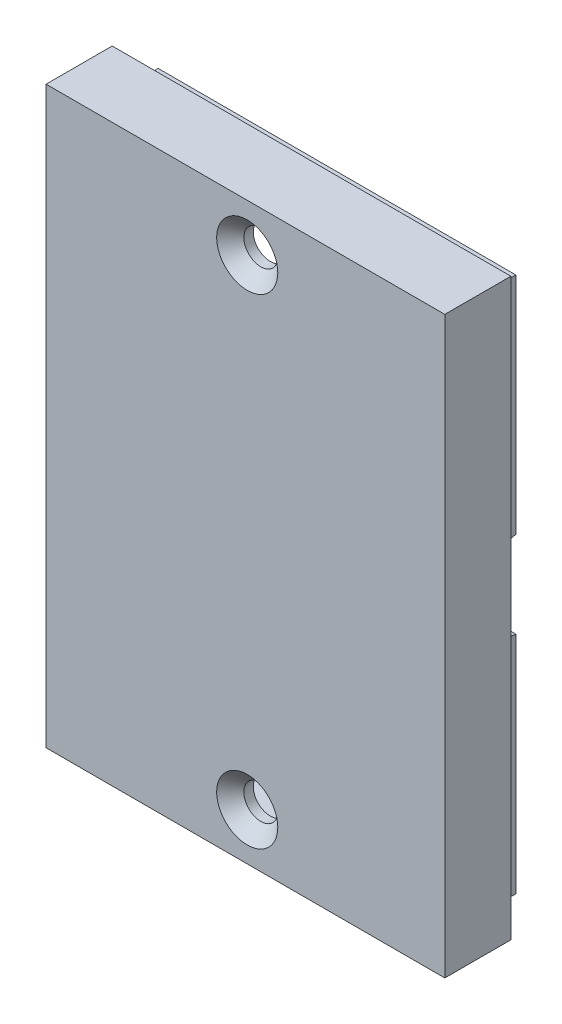
ISO-10303-21;
HEADER;
FILE_DESCRIPTION(('STEP AP214'),'2;1');
FILE_NAME('part.step','',(''),(''),'','','');
FILE_SCHEMA(('AUTOMOTIVE_DESIGN { 1 0 10303 214 1 1 1 1 }'));
ENDSEC;
DATA;
#1=APPLICATION_CONTEXT('core data for automotive mechanical design processes');
#2=APPLICATION_PROTOCOL_DEFINITION('international standard','automotive_design',2000,#1);
#3=PRODUCT_CONTEXT('',#1,'mechanical');
#4=PRODUCT('Part','Part','',(#3));
#5=PRODUCT_RELATED_PRODUCT_CATEGORY('part','',(#4));
#6=PRODUCT_DEFINITION_FORMATION('','',#4);
#7=PRODUCT_DEFINITION_CONTEXT('part definition',#1,'design');
#8=PRODUCT_DEFINITION('design','',#6,#7);
#9=PRODUCT_DEFINITION_SHAPE('','',#8);
#10=(LENGTH_UNIT() NAMED_UNIT(*) SI_UNIT(.MILLI.,.METRE.));
#11=(NAMED_UNIT(*) PLANE_ANGLE_UNIT() SI_UNIT($,.RADIAN.));
#12=(NAMED_UNIT(*) SI_UNIT($,.STERADIAN.) SOLID_ANGLE_UNIT());
#13=UNCERTAINTY_MEASURE_WITH_UNIT(LENGTH_MEASURE(1.E-05),#10,'distance_accuracy_value','');
#14=(GEOMETRIC_REPRESENTATION_CONTEXT(3) GLOBAL_UNCERTAINTY_ASSIGNED_CONTEXT((#13)) GLOBAL_UNIT_ASSIGNED_CONTEXT((#10,
#11,#12)) REPRESENTATION_CONTEXT('',''));
#15=CARTESIAN_POINT('',(0.,0.,0.));
#16=DIRECTION('',(0.,0.,1.));
#17=DIRECTION('',(1.,0.,0.));
#18=AXIS2_PLACEMENT_3D('',#15,#16,#17);
#19=CARTESIAN_POINT('',(0.,0.,0.));
#20=DIRECTION('',(0.,0.,1.));
#21=DIRECTION('',(1.,0.,0.));
#22=AXIS2_PLACEMENT_3D('',#19,#20,#21);
#23=PLANE('',#22);
#24=DIRECTION('',(-1.,0.,0.));
#25=VECTOR('',#24,1.);
#26=CARTESIAN_POINT('',(0.635,46.99,0.));
#27=LINE('',#26,#25);
#28=CARTESIAN_POINT('',(31.115,46.99,0.));
#29=VERTEX_POINT('',#28);
#30=CARTESIAN_POINT('',(0.127,46.99,0.));
#31=VERTEX_POINT('',#30);
#32=EDGE_CURVE('E230',#29,#31,#27,.T.);
#33=ORIENTED_EDGE('',*,*,#32,.T.);
#34=DIRECTION('',(0.,-1.,0.));
#35=VECTOR('',#34,1.);
#36=CARTESIAN_POINT('',(0.127,47.498,0.));
#37=LINE('',#36,#35);
#38=CARTESIAN_POINT('',(0.127,47.498,0.));
#39=VERTEX_POINT('',#38);
#40=EDGE_CURVE('E240',#39,#31,#37,.T.);
#41=ORIENTED_EDGE('',*,*,#40,.F.);
#42=DIRECTION('',(-1.,0.,0.));
#43=VECTOR('',#42,1.);
#44=CARTESIAN_POINT('',(0.127,47.498,0.));
#45=LINE('',#44,#43);
#46=CARTESIAN_POINT('',(31.75,47.498,0.));
#47=VERTEX_POINT('',#46);
#48=EDGE_CURVE('E280',#47,#39,#45,.T.);
#49=ORIENTED_EDGE('',*,*,#48,.F.);
#50=DIRECTION('',(0.,1.,0.));
#51=VECTOR('',#50,1.);
#52=CARTESIAN_POINT('',(31.75,47.498,0.));
#53=LINE('',#52,#51);
#54=CARTESIAN_POINT('',(31.75,27.6225,0.));
#55=VERTEX_POINT('',#54);
#56=EDGE_CURVE('E256',#55,#47,#53,.T.);
#57=ORIENTED_EDGE('',*,*,#56,.F.);
#58=DIRECTION('',(1.,0.,0.));
#59=VECTOR('',#58,1.);
#60=CARTESIAN_POINT('',(-1.906,27.6225,0.));
#61=LINE('',#60,#59);
#62=CARTESIAN_POINT('',(31.115,27.6225,0.));
#63=VERTEX_POINT('',#62);
#64=EDGE_CURVE('E389',#63,#55,#61,.T.);
#65=ORIENTED_EDGE('',*,*,#64,.F.);
#66=DIRECTION('',(0.,1.,0.));
#67=VECTOR('',#66,1.);
#68=CARTESIAN_POINT('',(31.115,46.99,0.));
#69=LINE('',#68,#67);
#70=EDGE_CURVE('E243',#63,#29,#69,.T.);
#71=ORIENTED_EDGE('',*,*,#70,.T.);
#72=EDGE_LOOP('',(#33,#41,#49,#57,#65,#71));
#73=FACE_BOUND('',#72,.T.);
#74=ADVANCED_FACE('F33',(#73),#23,.F.);
#75=CARTESIAN_POINT('',(0.127,44.45,0.));
#76=VERTEX_POINT('',#75);
#77=CARTESIAN_POINT('',(0.127000000000003,25.0825,0.));
#78=VERTEX_POINT('',#77);
#79=EDGE_CURVE('E253',#76,#78,#37,.T.);
#80=ORIENTED_EDGE('',*,*,#79,.F.);
#81=DIRECTION('',(-1.,0.,0.));
#82=VECTOR('',#81,1.);
#83=CARTESIAN_POINT('',(33.3385,44.45,0.));
#84=LINE('',#83,#82);
#85=CARTESIAN_POINT('',(0.635,44.45,0.));
#86=VERTEX_POINT('',#85);
#87=EDGE_CURVE('E359',#86,#76,#84,.T.);
#88=ORIENTED_EDGE('',*,*,#87,.F.);
#89=DIRECTION('',(0.,-1.,0.));
#90=VECTOR('',#89,1.);
#91=CARTESIAN_POINT('',(0.635,46.99,0.));
#92=LINE('',#91,#90);
#93=CARTESIAN_POINT('',(0.635000000000003,25.0825,0.));
#94=VERTEX_POINT('',#93);
#95=EDGE_CURVE('E459',#86,#94,#92,.T.);
#96=ORIENTED_EDGE('',*,*,#95,.T.);
#97=DIRECTION('',(-1.,0.,0.));
#98=VECTOR('',#97,1.);
#99=CARTESIAN_POINT('',(33.3385,25.0825,0.));
#100=LINE('',#99,#98);
#101=EDGE_CURVE('E369',#94,#78,#100,.T.);
#102=ORIENTED_EDGE('',*,*,#101,.T.);
#103=EDGE_LOOP('',(#80,#88,#96,#102));
#104=FACE_BOUND('',#103,.T.);
#105=ADVANCED_FACE('F485',(#104),#23,.F.);
#106=CARTESIAN_POINT('',(0.127000000000003,22.5425,0.));
#107=VERTEX_POINT('',#106);
#108=CARTESIAN_POINT('',(0.127000000000005,3.175,0.));
#109=VERTEX_POINT('',#108);
#110=EDGE_CURVE('E259',#107,#109,#37,.T.);
#111=ORIENTED_EDGE('',*,*,#110,.F.);
#112=DIRECTION('',(-1.,0.,0.));
#113=VECTOR('',#112,1.);
#114=CARTESIAN_POINT('',(33.3385,22.5425,0.));
#115=LINE('',#114,#113);
#116=CARTESIAN_POINT('',(0.635000000000003,22.5425,0.));
#117=VERTEX_POINT('',#116);
#118=EDGE_CURVE('E370',#117,#107,#115,.T.);
#119=ORIENTED_EDGE('',*,*,#118,.F.);
#120=CARTESIAN_POINT('',(0.635000000000005,3.175,0.));
#121=VERTEX_POINT('',#120);
#122=EDGE_CURVE('E456',#117,#121,#92,.T.);
#123=ORIENTED_EDGE('',*,*,#122,.T.);
#124=DIRECTION('',(-1.,0.,0.));
#125=VECTOR('',#124,1.);
#126=CARTESIAN_POINT('',(33.3385,3.175,0.));
#127=LINE('',#126,#125);
#128=EDGE_CURVE('E384',#121,#109,#127,.T.);
#129=ORIENTED_EDGE('',*,*,#128,.T.);
#130=EDGE_LOOP('',(#111,#119,#123,#129));
#131=FACE_BOUND('',#130,.T.);
#132=ADVANCED_FACE('F508',(#131),#23,.F.);
#133=CARTESIAN_POINT('',(0.127000000000006,0.634999999999997,0.));
#134=VERTEX_POINT('',#133);
#135=CARTESIAN_POINT('',(0.127000000000006,0.127000000000002,0.));
#136=VERTEX_POINT('',#135);
#137=EDGE_CURVE('E255',#134,#136,#37,.T.);
#138=ORIENTED_EDGE('',*,*,#137,.F.);
#139=DIRECTION('',(1.,0.,0.));
#140=VECTOR('',#139,1.);
#141=CARTESIAN_POINT('',(0.635000000000006,0.635,0.));
#142=LINE('',#141,#140);
#143=CARTESIAN_POINT('',(31.115,0.635,0.));
#144=VERTEX_POINT('',#143);
#145=EDGE_CURVE('E460',#134,#144,#142,.T.);
#146=ORIENTED_EDGE('',*,*,#145,.T.);
#147=CARTESIAN_POINT('',(31.115,20.0025,0.));
#148=VERTEX_POINT('',#147);
#149=EDGE_CURVE('E246',#144,#148,#69,.T.);
#150=ORIENTED_EDGE('',*,*,#149,.T.);
#151=DIRECTION('',(1.,0.,0.));
#152=VECTOR('',#151,1.);
#153=CARTESIAN_POINT('',(-1.906,20.0025,0.));
#154=LINE('',#153,#152);
#155=CARTESIAN_POINT('',(31.75,20.0025,0.));
#156=VERTEX_POINT('',#155);
#157=EDGE_CURVE('E234',#156,#148,#154,.F.);
#158=ORIENTED_EDGE('',*,*,#157,.F.);
#159=CARTESIAN_POINT('',(31.75,0.127,0.));
#160=VERTEX_POINT('',#159);
#161=EDGE_CURVE('E551',#160,#156,#53,.T.);
#162=ORIENTED_EDGE('',*,*,#161,.F.);
#163=DIRECTION('',(1.,0.,0.));
#164=VECTOR('',#163,1.);
#165=CARTESIAN_POINT('',(0.127000000000006,0.127000000000002,0.));
#166=LINE('',#165,#164);
#167=EDGE_CURVE('E252',#136,#160,#166,.T.);
#168=ORIENTED_EDGE('',*,*,#167,.F.);
#169=EDGE_LOOP('',(#138,#146,#150,#158,#162,#168));
#170=FACE_BOUND('',#169,.T.);
#171=ADVANCED_FACE('F535',(#170),#23,.F.);
#172=CARTESIAN_POINT('',(0.127,47.498,2.032));
#173=DIRECTION('',(1.,0.,0.));
#174=DIRECTION('',(0.,1.,0.));
#175=AXIS2_PLACEMENT_3D('',#172,#173,#174);
#176=PLANE('',#175);
#177=ORIENTED_EDGE('',*,*,#40,.T.);
#178=DIRECTION('',(0.,0.,-1.));
#179=VECTOR('',#178,1.);
#180=CARTESIAN_POINT('',(0.127,46.99,0.));
#181=LINE('',#180,#179);
#182=CARTESIAN_POINT('',(0.127,46.99,0.508));
#183=VERTEX_POINT('',#182);
#184=EDGE_CURVE('E226',#183,#31,#181,.T.);
#185=ORIENTED_EDGE('',*,*,#184,.F.);
#186=CARTESIAN_POINT('',(0.127,45.72,0.508));
#187=DIRECTION('',(1.,0.,0.));
#188=DIRECTION('',(0.,1.,0.));
#189=AXIS2_PLACEMENT_3D('',#186,#187,#188);
#190=CIRCLE('',#189,1.27);
#191=CARTESIAN_POINT('',(0.127,45.72,1.778));
#192=VERTEX_POINT('',#191);
#193=EDGE_CURVE('E56',#183,#192,#190,.T.);
#194=ORIENTED_EDGE('',*,*,#193,.T.);
#195=CARTESIAN_POINT('',(0.127000000000002,45.72,0.508));
#196=DIRECTION('',(1.,0.,0.));
#197=DIRECTION('',(0.,1.,0.));
#198=AXIS2_PLACEMENT_3D('',#195,#196,#197);
#199=CIRCLE('',#198,1.27);
#200=CARTESIAN_POINT('',(0.127,44.45,0.508));
#201=VERTEX_POINT('',#200);
#202=EDGE_CURVE('E42',#192,#201,#199,.T.);
#203=ORIENTED_EDGE('',*,*,#202,.T.);
#204=DIRECTION('',(0.,0.,1.));
#205=VECTOR('',#204,1.);
#206=CARTESIAN_POINT('',(0.127,44.45,0.));
#207=LINE('',#206,#205);
#208=EDGE_CURVE('E235',#76,#201,#207,.T.);
#209=ORIENTED_EDGE('',*,*,#208,.F.);
#210=ORIENTED_EDGE('',*,*,#79,.T.);
#211=DIRECTION('',(0.,0.,-1.));
#212=VECTOR('',#211,1.);
#213=CARTESIAN_POINT('',(0.127000000000003,25.0825,0.));
#214=LINE('',#213,#212);
#215=CARTESIAN_POINT('',(0.127000000000003,25.0825,0.508));
#216=VERTEX_POINT('',#215);
#217=EDGE_CURVE('E364',#216,#78,#214,.T.);
#218=ORIENTED_EDGE('',*,*,#217,.F.);
#219=CARTESIAN_POINT('',(0.127000000000002,23.8125,0.508));
#220=DIRECTION('',(1.,0.,0.));
#221=DIRECTION('',(0.,1.,0.));
#222=AXIS2_PLACEMENT_3D('',#219,#220,#221);
#223=CIRCLE('',#222,1.27);
#224=CARTESIAN_POINT('',(0.127000000000003,23.8125,1.778));
#225=VERTEX_POINT('',#224);
#226=EDGE_CURVE('E327',#216,#225,#223,.T.);
#227=ORIENTED_EDGE('',*,*,#226,.T.);
#228=CARTESIAN_POINT('',(0.127000000000002,23.8125,0.508));
#229=DIRECTION('',(1.,0.,0.));
#230=DIRECTION('',(0.,1.,0.));
#231=AXIS2_PLACEMENT_3D('',#228,#229,#230);
#232=CIRCLE('',#231,1.27);
#233=CARTESIAN_POINT('',(0.127000000000003,22.5425,0.508));
#234=VERTEX_POINT('',#233);
#235=EDGE_CURVE('E323',#225,#234,#232,.T.);
#236=ORIENTED_EDGE('',*,*,#235,.T.);
#237=DIRECTION('',(0.,0.,1.));
#238=VECTOR('',#237,1.);
#239=CARTESIAN_POINT('',(0.127000000000003,22.5425,0.));
#240=LINE('',#239,#238);
#241=EDGE_CURVE('E368',#107,#234,#240,.T.);
#242=ORIENTED_EDGE('',*,*,#241,.F.);
#243=ORIENTED_EDGE('',*,*,#110,.T.);
#244=DIRECTION('',(0.,0.,-1.));
#245=VECTOR('',#244,1.);
#246=CARTESIAN_POINT('',(0.127000000000005,3.175,0.));
#247=LINE('',#246,#245);
#248=CARTESIAN_POINT('',(0.127000000000005,3.175,0.508));
#249=VERTEX_POINT('',#248);
#250=EDGE_CURVE('E373',#249,#109,#247,.T.);
#251=ORIENTED_EDGE('',*,*,#250,.F.);
#252=CARTESIAN_POINT('',(0.127000000000009,1.905,0.508));
#253=DIRECTION('',(1.,0.,0.));
#254=DIRECTION('',(0.,1.,0.));
#255=AXIS2_PLACEMENT_3D('',#252,#253,#254);
#256=CIRCLE('',#255,1.27);
#257=CARTESIAN_POINT('',(0.127000000000006,1.905,1.778));
#258=VERTEX_POINT('',#257);
#259=EDGE_CURVE('E315',#249,#258,#256,.T.);
#260=ORIENTED_EDGE('',*,*,#259,.T.);
#261=CARTESIAN_POINT('',(0.127000000000009,1.905,0.508));
#262=DIRECTION('',(1.,0.,0.));
#263=DIRECTION('',(0.,1.,0.));
#264=AXIS2_PLACEMENT_3D('',#261,#262,#263);
#265=CIRCLE('',#264,1.27);
#266=CARTESIAN_POINT('',(0.127000000000006,0.634999999999998,0.508));
#267=VERTEX_POINT('',#266);
#268=EDGE_CURVE('E319',#258,#267,#265,.T.);
#269=ORIENTED_EDGE('',*,*,#268,.T.);
#270=DIRECTION('',(0.,0.,1.));
#271=VECTOR('',#270,1.);
#272=CARTESIAN_POINT('',(0.127000000000006,0.634999999999997,0.));
#273=LINE('',#272,#271);
#274=EDGE_CURVE('E381',#134,#267,#273,.T.);
#275=ORIENTED_EDGE('',*,*,#274,.F.);
#276=ORIENTED_EDGE('',*,*,#137,.T.);
#277=DIRECTION('',(0.,0.,-1.));
#278=VECTOR('',#277,1.);
#279=CARTESIAN_POINT('',(0.127000000000006,0.127000000000002,2.032));
#280=LINE('',#279,#278);
#281=CARTESIAN_POINT('',(0.127000000000006,0.127000000000002,2.032));
#282=VERTEX_POINT('',#281);
#283=EDGE_CURVE('E299',#282,#136,#280,.T.);
#284=ORIENTED_EDGE('',*,*,#283,.F.);
#285=DIRECTION('',(0.,-1.,0.));
#286=VECTOR('',#285,1.);
#287=CARTESIAN_POINT('',(0.127,47.498,2.032));
#288=LINE('',#287,#286);
#289=CARTESIAN_POINT('',(0.127,47.498,2.032));
#290=VERTEX_POINT('',#289);
#291=EDGE_CURVE('E276',#290,#282,#288,.T.);
#292=ORIENTED_EDGE('',*,*,#291,.F.);
#293=DIRECTION('',(0.,0.,-1.));
#294=VECTOR('',#293,1.);
#295=CARTESIAN_POINT('',(0.127,47.498,2.032));
#296=LINE('',#295,#294);
#297=EDGE_CURVE('E251',#290,#39,#296,.T.);
#298=ORIENTED_EDGE('',*,*,#297,.T.);
#299=EDGE_LOOP('',(#177,#185,#194,#203,#209,#210,#218,#227,#236,#242,#243,#251,#260,#269,#275,
#276,#284,#292,#298));
#300=FACE_BOUND('',#299,.T.);
#301=ADVANCED_FACE('F249',(#300),#176,.F.);
#302=CARTESIAN_POINT('',(0.127000000000006,0.127000000000002,2.032));
#303=DIRECTION('',(0.,1.,0.));
#304=DIRECTION('',(-1.,0.,0.));
#305=AXIS2_PLACEMENT_3D('',#302,#303,#304);
#306=PLANE('',#305);
#307=ORIENTED_EDGE('',*,*,#167,.T.);
#308=DIRECTION('',(0.,0.,-1.));
#309=VECTOR('',#308,1.);
#310=CARTESIAN_POINT('',(31.75,0.127,2.032));
#311=LINE('',#310,#309);
#312=CARTESIAN_POINT('',(31.75,0.127,2.032));
#313=VERTEX_POINT('',#312);
#314=EDGE_CURVE('E292',#313,#160,#311,.T.);
#315=ORIENTED_EDGE('',*,*,#314,.F.);
#316=DIRECTION('',(1.,0.,0.));
#317=VECTOR('',#316,1.);
#318=CARTESIAN_POINT('',(0.127000000000006,0.127000000000002,2.032));
#319=LINE('',#318,#317);
#320=EDGE_CURVE('E279',#282,#313,#319,.T.);
#321=ORIENTED_EDGE('',*,*,#320,.F.);
#322=ORIENTED_EDGE('',*,*,#283,.T.);
#323=EDGE_LOOP('',(#307,#315,#321,#322));
#324=FACE_BOUND('',#323,.T.);
#325=ADVANCED_FACE('F547',(#324),#306,.F.);
#326=CARTESIAN_POINT('',(31.75,47.498,2.032));
#327=DIRECTION('',(-1.,0.,0.));
#328=DIRECTION('',(0.,0.,1.));
#329=AXIS2_PLACEMENT_3D('',#326,#327,#328);
#330=PLANE('',#329);
#331=ORIENTED_EDGE('',*,*,#161,.T.);
#332=CARTESIAN_POINT('',(31.75,21.2725,0.));
#333=DIRECTION('',(1.,0.,0.));
#334=DIRECTION('',(0.,0.,-1.));
#335=AXIS2_PLACEMENT_3D('',#332,#333,#334);
#336=CIRCLE('',#335,1.27);
#337=CARTESIAN_POINT('',(31.75,21.2725,1.27));
#338=VERTEX_POINT('',#337);
#339=EDGE_CURVE('E403',#338,#156,#336,.T.);
#340=ORIENTED_EDGE('',*,*,#339,.F.);
#341=DIRECTION('',(0.,-1.,0.));
#342=VECTOR('',#341,1.);
#343=CARTESIAN_POINT('',(31.75,26.3525,1.27));
#344=LINE('',#343,#342);
#345=CARTESIAN_POINT('',(31.75,26.3525,1.27));
#346=VERTEX_POINT('',#345);
#347=EDGE_CURVE('E400',#346,#338,#344,.T.);
#348=ORIENTED_EDGE('',*,*,#347,.F.);
#349=CARTESIAN_POINT('',(31.75,26.3525,0.));
#350=DIRECTION('',(1.,0.,0.));
#351=DIRECTION('',(0.,0.,-1.));
#352=AXIS2_PLACEMENT_3D('',#349,#350,#351);
#353=CIRCLE('',#352,1.27);
#354=EDGE_CURVE('E397',#55,#346,#353,.T.);
#355=ORIENTED_EDGE('',*,*,#354,.F.);
#356=ORIENTED_EDGE('',*,*,#56,.T.);
#357=DIRECTION('',(0.,0.,-1.));
#358=VECTOR('',#357,1.);
#359=CARTESIAN_POINT('',(31.75,47.498,2.032));
#360=LINE('',#359,#358);
#361=CARTESIAN_POINT('',(31.75,47.498,2.032));
#362=VERTEX_POINT('',#361);
#363=EDGE_CURVE('E289',#362,#47,#360,.T.);
#364=ORIENTED_EDGE('',*,*,#363,.F.);
#365=DIRECTION('',(0.,1.,0.));
#366=VECTOR('',#365,1.);
#367=CARTESIAN_POINT('',(31.75,47.498,2.032));
#368=LINE('',#367,#366);
#369=EDGE_CURVE('E283',#313,#362,#368,.T.);
#370=ORIENTED_EDGE('',*,*,#369,.F.);
#371=ORIENTED_EDGE('',*,*,#314,.T.);
#372=EDGE_LOOP('',(#331,#340,#348,#355,#356,#364,#370,#371));
#373=FACE_BOUND('',#372,.T.);
#374=ADVANCED_FACE('F556',(#373),#330,.F.);
#375=CARTESIAN_POINT('',(0.127,47.498,2.032));
#376=DIRECTION('',(0.,-1.,0.));
#377=DIRECTION('',(0.,0.,-1.));
#378=AXIS2_PLACEMENT_3D('',#375,#376,#377);
#379=PLANE('',#378);
#380=ORIENTED_EDGE('',*,*,#48,.T.);
#381=ORIENTED_EDGE('',*,*,#297,.F.);
#382=DIRECTION('',(-1.,0.,0.));
#383=VECTOR('',#382,1.);
#384=CARTESIAN_POINT('',(0.127,47.498,2.032));
#385=LINE('',#384,#383);
#386=EDGE_CURVE('E285',#362,#290,#385,.T.);
#387=ORIENTED_EDGE('',*,*,#386,.F.);
#388=ORIENTED_EDGE('',*,*,#363,.T.);
#389=EDGE_LOOP('',(#380,#381,#387,#388));
#390=FACE_BOUND('',#389,.T.);
#391=ADVANCED_FACE('F560',(#390),#379,.F.);
#392=CARTESIAN_POINT('',(0.635,46.99,2.032));
#393=DIRECTION('',(1.,0.,0.));
#394=DIRECTION('',(0.,1.,0.));
#395=AXIS2_PLACEMENT_3D('',#392,#393,#394);
#396=PLANE('',#395);
#397=DIRECTION('',(0.,0.,1.));
#398=VECTOR('',#397,1.);
#399=CARTESIAN_POINT('',(0.634999999999997,44.45,0.));
#400=LINE('',#399,#398);
#401=CARTESIAN_POINT('',(0.634999999999997,44.45,0.508));
#402=VERTEX_POINT('',#401);
#403=EDGE_CURVE('E358',#86,#402,#400,.T.);
#404=ORIENTED_EDGE('',*,*,#403,.T.);
#405=CARTESIAN_POINT('',(0.634999999999997,45.72,0.508));
#406=DIRECTION('',(1.,0.,0.));
#407=DIRECTION('',(0.,1.,0.));
#408=AXIS2_PLACEMENT_3D('',#405,#406,#407);
#409=CIRCLE('',#408,1.27);
#410=CARTESIAN_POINT('',(0.634999999999997,45.72,1.778));
#411=VERTEX_POINT('',#410);
#412=EDGE_CURVE('E11',#402,#411,#409,.F.);
#413=ORIENTED_EDGE('',*,*,#412,.T.);
#414=CARTESIAN_POINT('',(0.635,45.72,0.508));
#415=DIRECTION('',(1.,0.,0.));
#416=DIRECTION('',(0.,1.,0.));
#417=AXIS2_PLACEMENT_3D('',#414,#415,#416);
#418=CIRCLE('',#417,1.27);
#419=CARTESIAN_POINT('',(0.635,46.99,0.508));
#420=VERTEX_POINT('',#419);
#421=EDGE_CURVE('E332',#411,#420,#418,.F.);
#422=ORIENTED_EDGE('',*,*,#421,.T.);
#423=DIRECTION('',(0.,0.,-1.));
#424=VECTOR('',#423,1.);
#425=CARTESIAN_POINT('',(0.635,46.99,2.032));
#426=LINE('',#425,#424);
#427=CARTESIAN_POINT('',(0.635,46.99,5.842));
#428=VERTEX_POINT('',#427);
#429=EDGE_CURVE('E245',#428,#420,#426,.T.);
#430=ORIENTED_EDGE('',*,*,#429,.F.);
#431=DIRECTION('',(0.,-1.,0.));
#432=VECTOR('',#431,1.);
#433=CARTESIAN_POINT('',(0.635,46.99,5.842));
#434=LINE('',#433,#432);
#435=CARTESIAN_POINT('',(0.635,0.635,5.842));
#436=VERTEX_POINT('',#435);
#437=EDGE_CURVE('E424',#428,#436,#434,.T.);
#438=ORIENTED_EDGE('',*,*,#437,.T.);
#439=DIRECTION('',(0.,0.,-1.));
#440=VECTOR('',#439,1.);
#441=CARTESIAN_POINT('',(0.635000000000006,0.635,2.032));
#442=LINE('',#441,#440);
#443=CARTESIAN_POINT('',(0.635000000000006,0.635,0.508));
#444=VERTEX_POINT('',#443);
#445=EDGE_CURVE('E261',#436,#444,#442,.T.);
#446=ORIENTED_EDGE('',*,*,#445,.T.);
#447=CARTESIAN_POINT('',(0.635000000000004,1.905,0.508));
#448=DIRECTION('',(1.,0.,0.));
#449=DIRECTION('',(0.,1.,0.));
#450=AXIS2_PLACEMENT_3D('',#447,#448,#449);
#451=CIRCLE('',#450,1.27);
#452=CARTESIAN_POINT('',(0.635000000000004,1.905,1.778));
#453=VERTEX_POINT('',#452);
#454=EDGE_CURVE('E321',#444,#453,#451,.F.);
#455=ORIENTED_EDGE('',*,*,#454,.T.);
#456=CARTESIAN_POINT('',(0.635000000000004,1.905,0.508));
#457=DIRECTION('',(1.,0.,0.));
#458=DIRECTION('',(0.,1.,0.));
#459=AXIS2_PLACEMENT_3D('',#456,#457,#458);
#460=CIRCLE('',#459,1.27);
#461=CARTESIAN_POINT('',(0.635000000000004,3.175,0.508));
#462=VERTEX_POINT('',#461);
#463=EDGE_CURVE('E317',#453,#462,#460,.F.);
#464=ORIENTED_EDGE('',*,*,#463,.T.);
#465=DIRECTION('',(0.,0.,-1.));
#466=VECTOR('',#465,1.);
#467=CARTESIAN_POINT('',(0.635000000000004,3.175,0.));
#468=LINE('',#467,#466);
#469=EDGE_CURVE('E338',#462,#121,#468,.T.);
#470=ORIENTED_EDGE('',*,*,#469,.T.);
#471=ORIENTED_EDGE('',*,*,#122,.F.);
#472=DIRECTION('',(0.,0.,1.));
#473=VECTOR('',#472,1.);
#474=CARTESIAN_POINT('',(0.634999999999997,22.5425,0.));
#475=LINE('',#474,#473);
#476=CARTESIAN_POINT('',(0.634999999999997,22.5425,0.508));
#477=VERTEX_POINT('',#476);
#478=EDGE_CURVE('E365',#117,#477,#475,.T.);
#479=ORIENTED_EDGE('',*,*,#478,.T.);
#480=CARTESIAN_POINT('',(0.634999999999997,23.8125,0.508));
#481=DIRECTION('',(1.,0.,0.));
#482=DIRECTION('',(0.,1.,0.));
#483=AXIS2_PLACEMENT_3D('',#480,#481,#482);
#484=CIRCLE('',#483,1.27);
#485=CARTESIAN_POINT('',(0.634999999999997,23.8125,1.778));
#486=VERTEX_POINT('',#485);
#487=EDGE_CURVE('E325',#477,#486,#484,.F.);
#488=ORIENTED_EDGE('',*,*,#487,.T.);
#489=CARTESIAN_POINT('',(0.634999999999997,23.8125,0.508));
#490=DIRECTION('',(1.,0.,0.));
#491=DIRECTION('',(0.,1.,0.));
#492=AXIS2_PLACEMENT_3D('',#489,#490,#491);
#493=CIRCLE('',#492,1.27);
#494=CARTESIAN_POINT('',(0.634999999999997,25.0825,0.508));
#495=VERTEX_POINT('',#494);
#496=EDGE_CURVE('E329',#486,#495,#493,.F.);
#497=ORIENTED_EDGE('',*,*,#496,.T.);
#498=DIRECTION('',(0.,0.,-1.));
#499=VECTOR('',#498,1.);
#500=CARTESIAN_POINT('',(0.634999999999997,25.0825,0.));
#501=LINE('',#500,#499);
#502=EDGE_CURVE('E372',#495,#94,#501,.T.);
#503=ORIENTED_EDGE('',*,*,#502,.T.);
#504=ORIENTED_EDGE('',*,*,#95,.F.);
#505=EDGE_LOOP('',(#404,#413,#422,#430,#438,#446,#455,#464,#470,#471,#479,#488,#497,#503,#504));
#506=FACE_BOUND('',#505,.T.);
#507=ADVANCED_FACE('F471',(#506),#396,.T.);
#508=CARTESIAN_POINT('',(0.635000000000006,0.635,2.032));
#509=DIRECTION('',(0.,1.,0.));
#510=DIRECTION('',(0.,0.,1.));
#511=AXIS2_PLACEMENT_3D('',#508,#509,#510);
#512=PLANE('',#511);
#513=ORIENTED_EDGE('',*,*,#274,.T.);
#514=DIRECTION('',(-1.,0.,0.));
#515=VECTOR('',#514,1.);
#516=CARTESIAN_POINT('',(0.635000000000006,0.635,0.508));
#517=LINE('',#516,#515);
#518=EDGE_CURVE('E305',#267,#444,#517,.F.);
#519=ORIENTED_EDGE('',*,*,#518,.T.);
#520=ORIENTED_EDGE('',*,*,#445,.F.);
#521=DIRECTION('',(1.,0.,0.));
#522=VECTOR('',#521,1.);
#523=CARTESIAN_POINT('',(0.635,0.635,5.842));
#524=LINE('',#523,#522);
#525=CARTESIAN_POINT('',(31.115,0.635,5.842));
#526=VERTEX_POINT('',#525);
#527=EDGE_CURVE('E426',#436,#526,#524,.T.);
#528=ORIENTED_EDGE('',*,*,#527,.T.);
#529=DIRECTION('',(0.,0.,-1.));
#530=VECTOR('',#529,1.);
#531=CARTESIAN_POINT('',(31.115,0.635,2.032));
#532=LINE('',#531,#530);
#533=EDGE_CURVE('E267',#526,#144,#532,.T.);
#534=ORIENTED_EDGE('',*,*,#533,.T.);
#535=ORIENTED_EDGE('',*,*,#145,.F.);
#536=EDGE_LOOP('',(#513,#519,#520,#528,#534,#535));
#537=FACE_BOUND('',#536,.T.);
#538=ADVANCED_FACE('F612',(#537),#512,.T.);
#539=CARTESIAN_POINT('',(31.115,46.99,2.032));
#540=DIRECTION('',(-1.,0.,0.));
#541=DIRECTION('',(0.,-1.,0.));
#542=AXIS2_PLACEMENT_3D('',#539,#540,#541);
#543=PLANE('',#542);
#544=CARTESIAN_POINT('',(31.115,21.2725,0.));
#545=DIRECTION('',(-1.,0.,0.));
#546=DIRECTION('',(0.,-1.,0.));
#547=AXIS2_PLACEMENT_3D('',#544,#545,#546);
#548=CIRCLE('',#547,1.27);
#549=CARTESIAN_POINT('',(31.115,21.2725,1.27));
#550=VERTEX_POINT('',#549);
#551=EDGE_CURVE('E391',#550,#148,#548,.F.);
#552=ORIENTED_EDGE('',*,*,#551,.T.);
#553=ORIENTED_EDGE('',*,*,#149,.F.);
#554=ORIENTED_EDGE('',*,*,#533,.F.);
#555=DIRECTION('',(0.,1.,0.));
#556=VECTOR('',#555,1.);
#557=CARTESIAN_POINT('',(31.115,46.99,5.842));
#558=LINE('',#557,#556);
#559=CARTESIAN_POINT('',(31.115,46.99,5.842));
#560=VERTEX_POINT('',#559);
#561=EDGE_CURVE('E429',#526,#560,#558,.T.);
#562=ORIENTED_EDGE('',*,*,#561,.T.);
#563=DIRECTION('',(0.,0.,-1.));
#564=VECTOR('',#563,1.);
#565=CARTESIAN_POINT('',(31.115,46.99,2.032));
#566=LINE('',#565,#564);
#567=EDGE_CURVE('E272',#560,#29,#566,.T.);
#568=ORIENTED_EDGE('',*,*,#567,.T.);
#569=ORIENTED_EDGE('',*,*,#70,.F.);
#570=CARTESIAN_POINT('',(31.115,26.3525,0.));
#571=DIRECTION('',(-1.,0.,0.));
#572=DIRECTION('',(0.,-1.,0.));
#573=AXIS2_PLACEMENT_3D('',#570,#571,#572);
#574=CIRCLE('',#573,1.27);
#575=CARTESIAN_POINT('',(31.115,26.3525,1.27));
#576=VERTEX_POINT('',#575);
#577=EDGE_CURVE('E394',#63,#576,#574,.F.);
#578=ORIENTED_EDGE('',*,*,#577,.T.);
#579=DIRECTION('',(0.,-1.,0.));
#580=VECTOR('',#579,1.);
#581=CARTESIAN_POINT('',(31.115,26.3525,1.27));
#582=LINE('',#581,#580);
#583=EDGE_CURVE('E408',#576,#550,#582,.T.);
#584=ORIENTED_EDGE('',*,*,#583,.T.);
#585=EDGE_LOOP('',(#552,#553,#554,#562,#568,#569,#578,#584));
#586=FACE_BOUND('',#585,.T.);
#587=ADVANCED_FACE('F466',(#586),#543,.T.);
#588=CARTESIAN_POINT('',(0.635,46.99,2.032));
#589=DIRECTION('',(0.,-1.,0.));
#590=DIRECTION('',(0.,0.,-1.));
#591=AXIS2_PLACEMENT_3D('',#588,#589,#590);
#592=PLANE('',#591);
#593=ORIENTED_EDGE('',*,*,#429,.T.);
#594=DIRECTION('',(-1.,0.,0.));
#595=VECTOR('',#594,1.);
#596=CARTESIAN_POINT('',(0.635,46.99,0.508));
#597=LINE('',#596,#595);
#598=EDGE_CURVE('E232',#420,#183,#597,.T.);
#599=ORIENTED_EDGE('',*,*,#598,.T.);
#600=ORIENTED_EDGE('',*,*,#184,.T.);
#601=ORIENTED_EDGE('',*,*,#32,.F.);
#602=ORIENTED_EDGE('',*,*,#567,.F.);
#603=DIRECTION('',(-1.,0.,0.));
#604=VECTOR('',#603,1.);
#605=CARTESIAN_POINT('',(0.635,46.99,5.842));
#606=LINE('',#605,#604);
#607=EDGE_CURVE('E432',#560,#428,#606,.T.);
#608=ORIENTED_EDGE('',*,*,#607,.T.);
#609=EDGE_LOOP('',(#593,#599,#600,#601,#602,#608));
#610=FACE_BOUND('',#609,.T.);
#611=ADVANCED_FACE('F228',(#610),#592,.T.);
#612=CARTESIAN_POINT('',(0.,0.,2.032));
#613=DIRECTION('',(0.,0.,1.));
#614=DIRECTION('',(1.,0.,0.));
#615=AXIS2_PLACEMENT_3D('',#612,#613,#614);
#616=PLANE('',#615);
#617=DIRECTION('',(0.,1.,0.));
#618=VECTOR('',#617,1.);
#619=CARTESIAN_POINT('',(33.3375,-1.5875,2.032));
#620=LINE('',#619,#618);
#621=CARTESIAN_POINT('',(33.3375,-1.5875,2.032));
#622=VERTEX_POINT('',#621);
#623=CARTESIAN_POINT('',(33.3375,49.2125,2.032));
#624=VERTEX_POINT('',#623);
#625=EDGE_CURVE('E435',#622,#624,#620,.T.);
#626=ORIENTED_EDGE('',*,*,#625,.F.);
#627=DIRECTION('',(1.,0.,0.));
#628=VECTOR('',#627,1.);
#629=CARTESIAN_POINT('',(33.3375,-1.5875,2.032));
#630=LINE('',#629,#628);
#631=CARTESIAN_POINT('',(-1.905,-1.5875,2.032));
#632=VERTEX_POINT('',#631);
#633=EDGE_CURVE('E442',#632,#622,#630,.T.);
#634=ORIENTED_EDGE('',*,*,#633,.F.);
#635=DIRECTION('',(0.,-1.,0.));
#636=VECTOR('',#635,1.);
#637=CARTESIAN_POINT('',(-1.905,-1.5875,2.032));
#638=LINE('',#637,#636);
#639=CARTESIAN_POINT('',(-1.905,49.2125,2.032));
#640=VERTEX_POINT('',#639);
#641=EDGE_CURVE('E440',#640,#632,#638,.T.);
#642=ORIENTED_EDGE('',*,*,#641,.F.);
#643=DIRECTION('',(-1.,0.,0.));
#644=VECTOR('',#643,1.);
#645=CARTESIAN_POINT('',(33.3375,49.2125,2.032));
#646=LINE('',#645,#644);
#647=EDGE_CURVE('E438',#624,#640,#646,.T.);
#648=ORIENTED_EDGE('',*,*,#647,.F.);
#649=EDGE_LOOP('',(#626,#634,#642,#648));
#650=FACE_BOUND('',#649,.T.);
#651=ORIENTED_EDGE('',*,*,#386,.T.);
#652=ORIENTED_EDGE('',*,*,#291,.T.);
#653=ORIENTED_EDGE('',*,*,#320,.T.);
#654=ORIENTED_EDGE('',*,*,#369,.T.);
#655=EDGE_LOOP('',(#651,#652,#653,#654));
#656=FACE_BOUND('',#655,.T.);
#657=ADVANCED_FACE('F553',(#650,#656),#616,.F.);
#658=CARTESIAN_POINT('',(33.3375,-1.5875,5.842));
#659=DIRECTION('',(-1.,0.,0.));
#660=DIRECTION('',(0.,0.,1.));
#661=AXIS2_PLACEMENT_3D('',#658,#659,#660);
#662=PLANE('',#661);
#663=ORIENTED_EDGE('',*,*,#625,.T.);
#664=DIRECTION('',(0.,0.,-1.));
#665=VECTOR('',#664,1.);
#666=CARTESIAN_POINT('',(33.3375,49.2125,5.842));
#667=LINE('',#666,#665);
#668=CARTESIAN_POINT('',(33.3375,49.2125,7.874));
#669=VERTEX_POINT('',#668);
#670=EDGE_CURVE('E453',#669,#624,#667,.T.);
#671=ORIENTED_EDGE('',*,*,#670,.F.);
#672=DIRECTION('',(0.,1.,0.));
#673=VECTOR('',#672,1.);
#674=CARTESIAN_POINT('',(33.3375,49.2125,7.874));
#675=LINE('',#674,#673);
#676=CARTESIAN_POINT('',(33.3375,-1.5875,7.874));
#677=VERTEX_POINT('',#676);
#678=EDGE_CURVE('E418',#677,#669,#675,.T.);
#679=ORIENTED_EDGE('',*,*,#678,.F.);
#680=DIRECTION('',(0.,0.,-1.));
#681=VECTOR('',#680,1.);
#682=CARTESIAN_POINT('',(33.3375,-1.5875,5.842));
#683=LINE('',#682,#681);
#684=EDGE_CURVE('E444',#677,#622,#683,.T.);
#685=ORIENTED_EDGE('',*,*,#684,.T.);
#686=EDGE_LOOP('',(#663,#671,#679,#685));
#687=FACE_BOUND('',#686,.T.);
#688=ADVANCED_FACE('F592',(#687),#662,.F.);
#689=CARTESIAN_POINT('',(33.3375,49.2125,5.842));
#690=DIRECTION('',(0.,-1.,0.));
#691=DIRECTION('',(1.,0.,0.));
#692=AXIS2_PLACEMENT_3D('',#689,#690,#691);
#693=PLANE('',#692);
#694=ORIENTED_EDGE('',*,*,#647,.T.);
#695=DIRECTION('',(0.,0.,-1.));
#696=VECTOR('',#695,1.);
#697=CARTESIAN_POINT('',(-1.905,49.2125,5.842));
#698=LINE('',#697,#696);
#699=CARTESIAN_POINT('',(-1.905,49.2125,7.874));
#700=VERTEX_POINT('',#699);
#701=EDGE_CURVE('E450',#700,#640,#698,.T.);
#702=ORIENTED_EDGE('',*,*,#701,.F.);
#703=DIRECTION('',(-1.,0.,0.));
#704=VECTOR('',#703,1.);
#705=CARTESIAN_POINT('',(-1.905,49.2125,7.874));
#706=LINE('',#705,#704);
#707=EDGE_CURVE('E421',#669,#700,#706,.T.);
#708=ORIENTED_EDGE('',*,*,#707,.F.);
#709=ORIENTED_EDGE('',*,*,#670,.T.);
#710=EDGE_LOOP('',(#694,#702,#708,#709));
#711=FACE_BOUND('',#710,.T.);
#712=ADVANCED_FACE('F600',(#711),#693,.F.);
#713=CARTESIAN_POINT('',(-1.905,-1.5875,5.842));
#714=DIRECTION('',(1.,0.,0.));
#715=DIRECTION('',(0.,1.,0.));
#716=AXIS2_PLACEMENT_3D('',#713,#714,#715);
#717=PLANE('',#716);
#718=ORIENTED_EDGE('',*,*,#641,.T.);
#719=DIRECTION('',(0.,0.,-1.));
#720=VECTOR('',#719,1.);
#721=CARTESIAN_POINT('',(-1.905,-1.5875,5.842));
#722=LINE('',#721,#720);
#723=CARTESIAN_POINT('',(-1.905,-1.5875,7.874));
#724=VERTEX_POINT('',#723);
#725=EDGE_CURVE('E447',#724,#632,#722,.T.);
#726=ORIENTED_EDGE('',*,*,#725,.F.);
#727=DIRECTION('',(0.,-1.,0.));
#728=VECTOR('',#727,1.);
#729=CARTESIAN_POINT('',(-1.905,49.2125,7.874));
#730=LINE('',#729,#728);
#731=EDGE_CURVE('E412',#700,#724,#730,.T.);
#732=ORIENTED_EDGE('',*,*,#731,.F.);
#733=ORIENTED_EDGE('',*,*,#701,.T.);
#734=EDGE_LOOP('',(#718,#726,#732,#733));
#735=FACE_BOUND('',#734,.T.);
#736=ADVANCED_FACE('F596',(#735),#717,.F.);
#737=CARTESIAN_POINT('',(33.3375,-1.5875,5.842));
#738=DIRECTION('',(0.,1.,0.));
#739=DIRECTION('',(-1.,0.,0.));
#740=AXIS2_PLACEMENT_3D('',#737,#738,#739);
#741=PLANE('',#740);
#742=ORIENTED_EDGE('',*,*,#633,.T.);
#743=ORIENTED_EDGE('',*,*,#684,.F.);
#744=DIRECTION('',(1.,0.,0.));
#745=VECTOR('',#744,1.);
#746=CARTESIAN_POINT('',(-1.905,-1.5875,7.874));
#747=LINE('',#746,#745);
#748=EDGE_CURVE('E415',#724,#677,#747,.T.);
#749=ORIENTED_EDGE('',*,*,#748,.F.);
#750=ORIENTED_EDGE('',*,*,#725,.T.);
#751=EDGE_LOOP('',(#742,#743,#749,#750));
#752=FACE_BOUND('',#751,.T.);
#753=ADVANCED_FACE('F588',(#752),#741,.F.);
#754=CARTESIAN_POINT('',(0.,0.,5.842));
#755=DIRECTION('',(0.,0.,1.));
#756=DIRECTION('',(1.,0.,0.));
#757=AXIS2_PLACEMENT_3D('',#754,#755,#756);
#758=PLANE('',#757);
#759=CARTESIAN_POINT('',(15.875,2.56461743111128,5.842));
#760=DIRECTION('',(0.,0.,1.));
#761=DIRECTION('',(1.,0.,0.));
#762=AXIS2_PLACEMENT_3D('',#759,#760,#761);
#763=CIRCLE('',#762,1.5);
#764=CARTESIAN_POINT('',(17.375,2.56461743111128,5.842));
#765=VERTEX_POINT('',#764);
#766=EDGE_CURVE('E37',#765,#765,#763,.T.);
#767=ORIENTED_EDGE('',*,*,#766,.T.);
#768=EDGE_LOOP('',(#767));
#769=FACE_BOUND('',#768,.T.);
#770=CARTESIAN_POINT('',(15.875,45.0168690661683,5.842));
#771=DIRECTION('',(0.,0.,1.));
#772=DIRECTION('',(1.,0.,0.));
#773=AXIS2_PLACEMENT_3D('',#770,#771,#772);
#774=CIRCLE('',#773,1.5);
#775=CARTESIAN_POINT('',(17.375,45.0168690661683,5.842));
#776=VERTEX_POINT('',#775);
#777=EDGE_CURVE('E344',#776,#776,#774,.T.);
#778=ORIENTED_EDGE('',*,*,#777,.T.);
#779=EDGE_LOOP('',(#778));
#780=FACE_BOUND('',#779,.T.);
#781=ORIENTED_EDGE('',*,*,#527,.F.);
#782=ORIENTED_EDGE('',*,*,#437,.F.);
#783=ORIENTED_EDGE('',*,*,#607,.F.);
#784=ORIENTED_EDGE('',*,*,#561,.F.);
#785=EDGE_LOOP('',(#781,#782,#783,#784));
#786=FACE_BOUND('',#785,.T.);
#787=ADVANCED_FACE('F470',(#769,#780,#786),#758,.F.);
#788=CARTESIAN_POINT('',(0.,0.,7.874));
#789=DIRECTION('',(0.,0.,1.));
#790=DIRECTION('',(1.,0.,0.));
#791=AXIS2_PLACEMENT_3D('',#788,#789,#790);
#792=PLANE('',#791);
#793=CARTESIAN_POINT('',(15.875,2.56461743111128,7.874));
#794=DIRECTION('',(0.,0.,1.));
#795=DIRECTION('',(1.,0.,0.));
#796=AXIS2_PLACEMENT_3D('',#793,#794,#795);
#797=CIRCLE('',#796,2.7);
#798=CARTESIAN_POINT('',(18.575,2.56461743111128,7.874));
#799=VERTEX_POINT('',#798);
#800=EDGE_CURVE('E835',#799,#799,#797,.T.);
#801=ORIENTED_EDGE('',*,*,#800,.F.);
#802=EDGE_LOOP('',(#801));
#803=FACE_BOUND('',#802,.T.);
#804=CARTESIAN_POINT('',(15.875,45.0168690661683,7.874));
#805=DIRECTION('',(0.,0.,1.));
#806=DIRECTION('',(1.,0.,0.));
#807=AXIS2_PLACEMENT_3D('',#804,#805,#806);
#808=CIRCLE('',#807,2.7);
#809=CARTESIAN_POINT('',(18.575,45.0168690661683,7.874));
#810=VERTEX_POINT('',#809);
#811=EDGE_CURVE('E350',#810,#810,#808,.T.);
#812=ORIENTED_EDGE('',*,*,#811,.F.);
#813=EDGE_LOOP('',(#812));
#814=FACE_BOUND('',#813,.T.);
#815=ORIENTED_EDGE('',*,*,#731,.T.);
#816=ORIENTED_EDGE('',*,*,#748,.T.);
#817=ORIENTED_EDGE('',*,*,#678,.T.);
#818=ORIENTED_EDGE('',*,*,#707,.T.);
#819=EDGE_LOOP('',(#815,#816,#817,#818));
#820=FACE_BOUND('',#819,.T.);
#821=ADVANCED_FACE('F582',(#803,#814,#820),#792,.T.);
#822=CARTESIAN_POINT('',(-1.906,26.3525,1.27));
#823=DIRECTION('',(0.,0.,1.));
#824=DIRECTION('',(0.,-1.,0.));
#825=AXIS2_PLACEMENT_3D('',#822,#823,#824);
#826=PLANE('',#825);
#827=DIRECTION('',(1.,0.,0.));
#828=VECTOR('',#827,1.);
#829=CARTESIAN_POINT('',(-1.906,26.3525,1.27));
#830=LINE('',#829,#828);
#831=EDGE_CURVE('E405',#576,#346,#830,.T.);
#832=ORIENTED_EDGE('',*,*,#831,.T.);
#833=ORIENTED_EDGE('',*,*,#347,.T.);
#834=DIRECTION('',(1.,0.,0.));
#835=VECTOR('',#834,1.);
#836=CARTESIAN_POINT('',(-1.906,21.2725,1.27));
#837=LINE('',#836,#835);
#838=EDGE_CURVE('E406',#550,#338,#837,.T.);
#839=ORIENTED_EDGE('',*,*,#838,.F.);
#840=ORIENTED_EDGE('',*,*,#583,.F.);
#841=EDGE_LOOP('',(#832,#833,#839,#840));
#842=FACE_BOUND('',#841,.T.);
#843=ADVANCED_FACE('F569',(#842),#826,.F.);
#844=CARTESIAN_POINT('',(-1.906,21.2725,0.));
#845=DIRECTION('',(1.,0.,0.));
#846=DIRECTION('',(0.,0.,-1.));
#847=AXIS2_PLACEMENT_3D('',#844,#845,#846);
#848=CYLINDRICAL_SURFACE('',#847,1.27);
#849=ORIENTED_EDGE('',*,*,#157,.T.);
#850=ORIENTED_EDGE('',*,*,#551,.F.);
#851=ORIENTED_EDGE('',*,*,#838,.T.);
#852=ORIENTED_EDGE('',*,*,#339,.T.);
#853=EDGE_LOOP('',(#849,#850,#851,#852));
#854=FACE_BOUND('',#853,.T.);
#855=ADVANCED_FACE('F564',(#854),#848,.F.);
#856=CARTESIAN_POINT('',(-1.906,26.3525,0.));
#857=DIRECTION('',(1.,0.,0.));
#858=DIRECTION('',(0.,0.,-1.));
#859=AXIS2_PLACEMENT_3D('',#856,#857,#858);
#860=CYLINDRICAL_SURFACE('',#859,1.27);
#861=ORIENTED_EDGE('',*,*,#64,.T.);
#862=ORIENTED_EDGE('',*,*,#354,.T.);
#863=ORIENTED_EDGE('',*,*,#831,.F.);
#864=ORIENTED_EDGE('',*,*,#577,.F.);
#865=EDGE_LOOP('',(#861,#862,#863,#864));
#866=FACE_BOUND('',#865,.T.);
#867=ADVANCED_FACE('F571',(#866),#860,.F.);
#868=CARTESIAN_POINT('',(33.3385,44.45,0.));
#869=DIRECTION('',(0.,-1.,0.));
#870=DIRECTION('',(1.,0.,0.));
#871=AXIS2_PLACEMENT_3D('',#868,#869,#870);
#872=PLANE('',#871);
#873=ORIENTED_EDGE('',*,*,#208,.T.);
#874=DIRECTION('',(-1.,0.,0.));
#875=VECTOR('',#874,1.);
#876=CARTESIAN_POINT('',(0.634999999999997,44.45,0.508));
#877=LINE('',#876,#875);
#878=EDGE_CURVE('E313',#201,#402,#877,.F.);
#879=ORIENTED_EDGE('',*,*,#878,.T.);
#880=ORIENTED_EDGE('',*,*,#403,.F.);
#881=ORIENTED_EDGE('',*,*,#87,.T.);
#882=EDGE_LOOP('',(#873,#879,#880,#881));
#883=FACE_BOUND('',#882,.T.);
#884=ADVANCED_FACE('F480',(#883),#872,.F.);
#885=CARTESIAN_POINT('',(33.3385,3.175,0.));
#886=DIRECTION('',(0.,1.,0.));
#887=DIRECTION('',(-1.,0.,0.));
#888=AXIS2_PLACEMENT_3D('',#885,#886,#887);
#889=PLANE('',#888);
#890=ORIENTED_EDGE('',*,*,#469,.F.);
#891=DIRECTION('',(-1.,0.,0.));
#892=VECTOR('',#891,1.);
#893=CARTESIAN_POINT('',(0.127000000000002,3.175,0.508));
#894=LINE('',#893,#892);
#895=EDGE_CURVE('E302',#462,#249,#894,.T.);
#896=ORIENTED_EDGE('',*,*,#895,.T.);
#897=ORIENTED_EDGE('',*,*,#250,.T.);
#898=ORIENTED_EDGE('',*,*,#128,.F.);
#899=EDGE_LOOP('',(#890,#896,#897,#898));
#900=FACE_BOUND('',#899,.T.);
#901=ADVANCED_FACE('F514',(#900),#889,.F.);
#902=CARTESIAN_POINT('',(33.3385,25.0825,0.));
#903=DIRECTION('',(0.,1.,0.));
#904=DIRECTION('',(-1.,0.,0.));
#905=AXIS2_PLACEMENT_3D('',#902,#903,#904);
#906=PLANE('',#905);
#907=ORIENTED_EDGE('',*,*,#502,.F.);
#908=DIRECTION('',(-1.,0.,0.));
#909=VECTOR('',#908,1.);
#910=CARTESIAN_POINT('',(0.127000000000002,25.0825,0.508));
#911=LINE('',#910,#909);
#912=EDGE_CURVE('E310',#495,#216,#911,.T.);
#913=ORIENTED_EDGE('',*,*,#912,.T.);
#914=ORIENTED_EDGE('',*,*,#217,.T.);
#915=ORIENTED_EDGE('',*,*,#101,.F.);
#916=EDGE_LOOP('',(#907,#913,#914,#915));
#917=FACE_BOUND('',#916,.T.);
#918=ADVANCED_FACE('F491',(#917),#906,.F.);
#919=CARTESIAN_POINT('',(33.3385,22.5425,0.));
#920=DIRECTION('',(0.,-1.,0.));
#921=DIRECTION('',(1.,0.,0.));
#922=AXIS2_PLACEMENT_3D('',#919,#920,#921);
#923=PLANE('',#922);
#924=ORIENTED_EDGE('',*,*,#241,.T.);
#925=DIRECTION('',(-1.,0.,0.));
#926=VECTOR('',#925,1.);
#927=CARTESIAN_POINT('',(0.635000000000004,22.5425,0.508));
#928=LINE('',#927,#926);
#929=EDGE_CURVE('E307',#234,#477,#928,.F.);
#930=ORIENTED_EDGE('',*,*,#929,.T.);
#931=ORIENTED_EDGE('',*,*,#478,.F.);
#932=ORIENTED_EDGE('',*,*,#118,.T.);
#933=EDGE_LOOP('',(#924,#930,#931,#932));
#934=FACE_BOUND('',#933,.T.);
#935=ADVANCED_FACE('F504',(#934),#923,.F.);
#936=CARTESIAN_POINT('',(33.3385,1.905,0.508));
#937=DIRECTION('',(-1.,0.,0.));
#938=DIRECTION('',(0.,0.,1.));
#939=AXIS2_PLACEMENT_3D('',#936,#937,#938);
#940=CYLINDRICAL_SURFACE('',#939,1.27);
#941=DIRECTION('',(-1.,0.,0.));
#942=VECTOR('',#941,1.);
#943=CARTESIAN_POINT('',(33.3385,1.905,1.778));
#944=LINE('',#943,#942);
#945=EDGE_CURVE('E335',#453,#258,#944,.T.);
#946=ORIENTED_EDGE('',*,*,#945,.F.);
#947=ORIENTED_EDGE('',*,*,#454,.F.);
#948=ORIENTED_EDGE('',*,*,#518,.F.);
#949=ORIENTED_EDGE('',*,*,#268,.F.);
#950=EDGE_LOOP('',(#946,#947,#948,#949));
#951=FACE_BOUND('',#950,.T.);
#952=ADVANCED_FACE('F521',(#951),#940,.F.);
#953=CARTESIAN_POINT('',(33.3385,1.905,0.508));
#954=DIRECTION('',(1.,0.,0.));
#955=DIRECTION('',(0.,1.,0.));
#956=AXIS2_PLACEMENT_3D('',#953,#954,#955);
#957=CYLINDRICAL_SURFACE('',#956,1.27);
#958=ORIENTED_EDGE('',*,*,#463,.F.);
#959=ORIENTED_EDGE('',*,*,#945,.T.);
#960=ORIENTED_EDGE('',*,*,#259,.F.);
#961=ORIENTED_EDGE('',*,*,#895,.F.);
#962=EDGE_LOOP('',(#958,#959,#960,#961));
#963=FACE_BOUND('',#962,.T.);
#964=ADVANCED_FACE('F523',(#963),#957,.F.);
#965=CARTESIAN_POINT('',(33.3385,23.8125,0.508));
#966=DIRECTION('',(1.,0.,0.));
#967=DIRECTION('',(0.,1.,0.));
#968=AXIS2_PLACEMENT_3D('',#965,#966,#967);
#969=CYLINDRICAL_SURFACE('',#968,1.27);
#970=ORIENTED_EDGE('',*,*,#912,.F.);
#971=ORIENTED_EDGE('',*,*,#496,.F.);
#972=DIRECTION('',(-1.,0.,0.));
#973=VECTOR('',#972,1.);
#974=CARTESIAN_POINT('',(0.634999999999997,23.8125,1.778));
#975=LINE('',#974,#973);
#976=EDGE_CURVE('E339',#225,#486,#975,.F.);
#977=ORIENTED_EDGE('',*,*,#976,.F.);
#978=ORIENTED_EDGE('',*,*,#226,.F.);
#979=EDGE_LOOP('',(#970,#971,#977,#978));
#980=FACE_BOUND('',#979,.T.);
#981=ADVANCED_FACE('F496',(#980),#969,.F.);
#982=CARTESIAN_POINT('',(33.3385,23.8125,0.508));
#983=DIRECTION('',(1.,0.,0.));
#984=DIRECTION('',(0.,1.,0.));
#985=AXIS2_PLACEMENT_3D('',#982,#983,#984);
#986=CYLINDRICAL_SURFACE('',#985,1.27);
#987=ORIENTED_EDGE('',*,*,#487,.F.);
#988=ORIENTED_EDGE('',*,*,#929,.F.);
#989=ORIENTED_EDGE('',*,*,#235,.F.);
#990=ORIENTED_EDGE('',*,*,#976,.T.);
#991=EDGE_LOOP('',(#987,#988,#989,#990));
#992=FACE_BOUND('',#991,.T.);
#993=ADVANCED_FACE('F500',(#992),#986,.F.);
#994=CARTESIAN_POINT('',(33.3385,45.72,0.508));
#995=DIRECTION('',(1.,0.,0.));
#996=DIRECTION('',(0.,1.,0.));
#997=AXIS2_PLACEMENT_3D('',#994,#995,#996);
#998=CYLINDRICAL_SURFACE('',#997,1.27);
#999=DIRECTION('',(-1.,0.,0.));
#1000=VECTOR('',#999,1.);
#1001=CARTESIAN_POINT('',(0.127000000000002,45.72,1.778));
#1002=LINE('',#1001,#1000);
#1003=EDGE_CURVE('E342',#411,#192,#1002,.T.);
#1004=ORIENTED_EDGE('',*,*,#1003,.F.);
#1005=ORIENTED_EDGE('',*,*,#412,.F.);
#1006=ORIENTED_EDGE('',*,*,#878,.F.);
#1007=ORIENTED_EDGE('',*,*,#202,.F.);
#1008=EDGE_LOOP('',(#1004,#1005,#1006,#1007));
#1009=FACE_BOUND('',#1008,.T.);
#1010=ADVANCED_FACE('F35',(#1009),#998,.F.);
#1011=CARTESIAN_POINT('',(0.635,45.72,0.508));
#1012=DIRECTION('',(-1.,0.,0.));
#1013=DIRECTION('',(0.,0.,1.));
#1014=AXIS2_PLACEMENT_3D('',#1011,#1012,#1013);
#1015=CYLINDRICAL_SURFACE('',#1014,1.27);
#1016=ORIENTED_EDGE('',*,*,#421,.F.);
#1017=ORIENTED_EDGE('',*,*,#1003,.T.);
#1018=ORIENTED_EDGE('',*,*,#193,.F.);
#1019=ORIENTED_EDGE('',*,*,#598,.F.);
#1020=EDGE_LOOP('',(#1016,#1017,#1018,#1019));
#1021=FACE_BOUND('',#1020,.T.);
#1022=ADVANCED_FACE('F474',(#1021),#1015,.F.);
#1023=CARTESIAN_POINT('',(15.875,45.0168690661683,7.874));
#1024=DIRECTION('',(0.,0.,1.));
#1025=DIRECTION('',(1.,0.,0.));
#1026=AXIS2_PLACEMENT_3D('',#1023,#1024,#1025);
#1027=CYLINDRICAL_SURFACE('',#1026,1.5);
#1028=CARTESIAN_POINT('',(15.875,45.0168690661683,6.674));
#1029=DIRECTION('',(0.,0.,1.));
#1030=DIRECTION('',(1.,0.,0.));
#1031=AXIS2_PLACEMENT_3D('',#1028,#1029,#1030);
#1032=CIRCLE('',#1031,1.5);
#1033=CARTESIAN_POINT('',(17.375,45.0168690661683,6.674));
#1034=VERTEX_POINT('',#1033);
#1035=EDGE_CURVE('E346',#1034,#1034,#1032,.T.);
#1036=ORIENTED_EDGE('',*,*,#1035,.T.);
#1037=EDGE_LOOP('',(#1036));
#1038=FACE_BOUND('',#1037,.T.);
#1039=ORIENTED_EDGE('',*,*,#777,.F.);
#1040=EDGE_LOOP('',(#1039));
#1041=FACE_BOUND('',#1040,.T.);
#1042=ADVANCED_FACE('F777',(#1038,#1041),#1027,.F.);
#1043=CARTESIAN_POINT('',(15.875,45.0168690661683,7.874));
#1044=DIRECTION('',(0.,0.,1.));
#1045=DIRECTION('',(1.,0.,0.));
#1046=AXIS2_PLACEMENT_3D('',#1043,#1044,#1045);
#1047=CONICAL_SURFACE('',#1046,2.7,0.785398163397448);
#1048=ORIENTED_EDGE('',*,*,#1035,.F.);
#1049=EDGE_LOOP('',(#1048));
#1050=FACE_BOUND('',#1049,.T.);
#1051=ORIENTED_EDGE('',*,*,#811,.T.);
#1052=EDGE_LOOP('',(#1051));
#1053=FACE_BOUND('',#1052,.T.);
#1054=ADVANCED_FACE('F796',(#1050,#1053),#1047,.F.);
#1055=CARTESIAN_POINT('',(15.875,2.56461743111128,7.874));
#1056=DIRECTION('',(0.,0.,1.));
#1057=DIRECTION('',(1.,0.,0.));
#1058=AXIS2_PLACEMENT_3D('',#1055,#1056,#1057);
#1059=CYLINDRICAL_SURFACE('',#1058,1.5);
#1060=CARTESIAN_POINT('',(15.875,2.56461743111128,6.674));
#1061=DIRECTION('',(0.,0.,1.));
#1062=DIRECTION('',(1.,0.,0.));
#1063=AXIS2_PLACEMENT_3D('',#1060,#1061,#1062);
#1064=CIRCLE('',#1063,1.5);
#1065=CARTESIAN_POINT('',(17.375,2.56461743111128,6.674));
#1066=VERTEX_POINT('',#1065);
#1067=EDGE_CURVE('E832',#1066,#1066,#1064,.T.);
#1068=ORIENTED_EDGE('',*,*,#1067,.T.);
#1069=EDGE_LOOP('',(#1068));
#1070=FACE_BOUND('',#1069,.T.);
#1071=ORIENTED_EDGE('',*,*,#766,.F.);
#1072=EDGE_LOOP('',(#1071));
#1073=FACE_BOUND('',#1072,.T.);
#1074=ADVANCED_FACE('F805',(#1070,#1073),#1059,.F.);
#1075=CARTESIAN_POINT('',(15.875,2.56461743111128,7.874));
#1076=DIRECTION('',(0.,0.,1.));
#1077=DIRECTION('',(1.,0.,0.));
#1078=AXIS2_PLACEMENT_3D('',#1075,#1076,#1077);
#1079=CONICAL_SURFACE('',#1078,2.7,0.785398163397448);
#1080=ORIENTED_EDGE('',*,*,#1067,.F.);
#1081=EDGE_LOOP('',(#1080));
#1082=FACE_BOUND('',#1081,.T.);
#1083=ORIENTED_EDGE('',*,*,#800,.T.);
#1084=EDGE_LOOP('',(#1083));
#1085=FACE_BOUND('',#1084,.T.);
#1086=ADVANCED_FACE('F815',(#1082,#1085),#1079,.F.);
#1087=CLOSED_SHELL('',(#74,#105,#132,#171,#301,#325,#374,#391,#507,#538,#587,#611,#657,#688,
#712,#736,#753,#787,#821,#843,#855,#867,#884,#901,#918,#935,#952,#964,#981,#993,#1010,#1022,
#1042,#1054,#1074,#1086));
#1088=MANIFOLD_SOLID_BREP('B2',#1087);
#1089=ADVANCED_BREP_SHAPE_REPRESENTATION('',(#18,#1088),#14);
#1090=SHAPE_DEFINITION_REPRESENTATION(#9,#1089);
ENDSEC;
END-ISO-10303-21;
